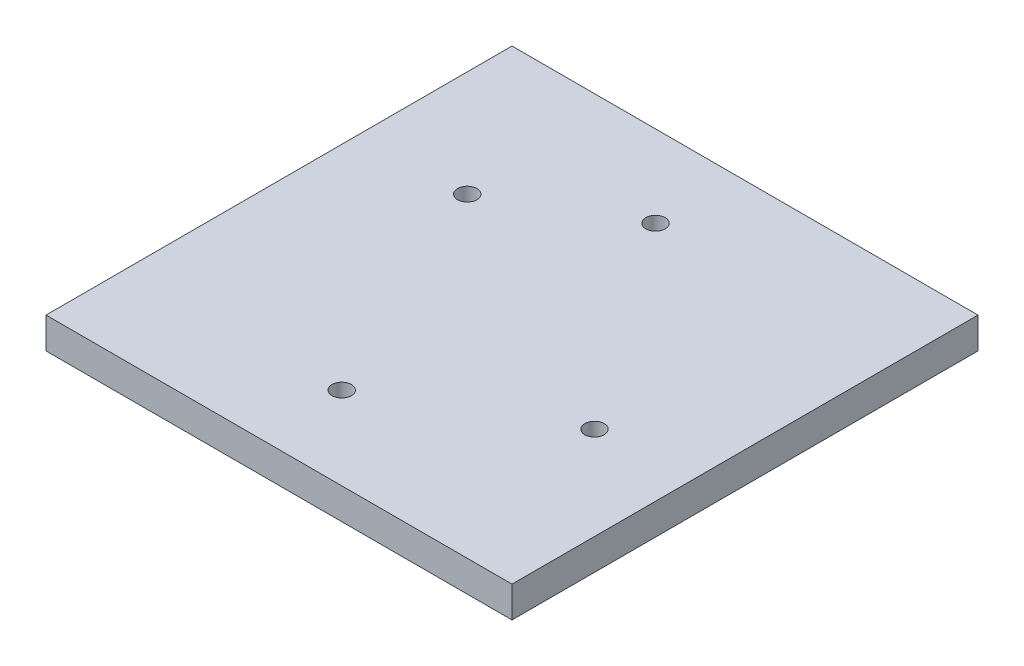
ISO-10303-21;
HEADER;
FILE_DESCRIPTION(('STEP AP214'),'2;1');
FILE_NAME('part.step','',(''),(''),'','','');
FILE_SCHEMA(('AUTOMOTIVE_DESIGN { 1 0 10303 214 1 1 1 1 }'));
ENDSEC;
DATA;
#1=APPLICATION_CONTEXT('core data for automotive mechanical design processes');
#2=APPLICATION_PROTOCOL_DEFINITION('international standard','automotive_design',2000,#1);
#3=PRODUCT_CONTEXT('',#1,'mechanical');
#4=PRODUCT('Part','Part','',(#3));
#5=PRODUCT_RELATED_PRODUCT_CATEGORY('part','',(#4));
#6=PRODUCT_DEFINITION_FORMATION('','',#4);
#7=PRODUCT_DEFINITION_CONTEXT('part definition',#1,'design');
#8=PRODUCT_DEFINITION('design','',#6,#7);
#9=PRODUCT_DEFINITION_SHAPE('','',#8);
#10=(LENGTH_UNIT() NAMED_UNIT(*) SI_UNIT(.MILLI.,.METRE.));
#11=(NAMED_UNIT(*) PLANE_ANGLE_UNIT() SI_UNIT($,.RADIAN.));
#12=(NAMED_UNIT(*) SI_UNIT($,.STERADIAN.) SOLID_ANGLE_UNIT());
#13=UNCERTAINTY_MEASURE_WITH_UNIT(LENGTH_MEASURE(1.E-05),#10,'distance_accuracy_value','');
#14=(GEOMETRIC_REPRESENTATION_CONTEXT(3) GLOBAL_UNCERTAINTY_ASSIGNED_CONTEXT((#13)) GLOBAL_UNIT_ASSIGNED_CONTEXT((#10,
#11,#12)) REPRESENTATION_CONTEXT('',''));
#15=CARTESIAN_POINT('',(0.,0.,0.));
#16=DIRECTION('',(0.,0.,1.));
#17=DIRECTION('',(1.,0.,0.));
#18=AXIS2_PLACEMENT_3D('',#15,#16,#17);
#19=CARTESIAN_POINT('',(76.2,10.16,76.2));
#20=DIRECTION('',(-1.,0.,0.));
#21=DIRECTION('',(0.,0.,1.));
#22=AXIS2_PLACEMENT_3D('',#19,#20,#21);
#23=PLANE('',#22);
#24=DIRECTION('',(0.,0.,-1.));
#25=VECTOR('',#24,1.);
#26=CARTESIAN_POINT('',(76.2,0.,76.2));
#27=LINE('',#26,#25);
#28=CARTESIAN_POINT('',(76.2,0.,76.2));
#29=VERTEX_POINT('',#28);
#30=CARTESIAN_POINT('',(76.2,0.,-76.2));
#31=VERTEX_POINT('',#30);
#32=EDGE_CURVE('E110',#29,#31,#27,.T.);
#33=ORIENTED_EDGE('',*,*,#32,.T.);
#34=DIRECTION('',(0.,-1.,0.));
#35=VECTOR('',#34,1.);
#36=CARTESIAN_POINT('',(76.2,10.16,-76.2));
#37=LINE('',#36,#35);
#38=CARTESIAN_POINT('',(76.2,10.16,-76.2));
#39=VERTEX_POINT('',#38);
#40=EDGE_CURVE('E42',#39,#31,#37,.T.);
#41=ORIENTED_EDGE('',*,*,#40,.F.);
#42=DIRECTION('',(0.,0.,-1.));
#43=VECTOR('',#42,1.);
#44=CARTESIAN_POINT('',(76.2,10.16,76.2));
#45=LINE('',#44,#43);
#46=CARTESIAN_POINT('',(76.2,10.16,76.2));
#47=VERTEX_POINT('',#46);
#48=EDGE_CURVE('E93',#47,#39,#45,.T.);
#49=ORIENTED_EDGE('',*,*,#48,.F.);
#50=DIRECTION('',(0.,-1.,0.));
#51=VECTOR('',#50,1.);
#52=CARTESIAN_POINT('',(76.2,10.16,76.2));
#53=LINE('',#52,#51);
#54=EDGE_CURVE('E106',#47,#29,#53,.T.);
#55=ORIENTED_EDGE('',*,*,#54,.T.);
#56=EDGE_LOOP('',(#33,#41,#49,#55));
#57=FACE_BOUND('',#56,.T.);
#58=ADVANCED_FACE('F39',(#57),#23,.F.);
#59=CARTESIAN_POINT('',(-76.2,10.16,-76.2));
#60=DIRECTION('',(0.,0.,1.));
#61=DIRECTION('',(1.,0.,0.));
#62=AXIS2_PLACEMENT_3D('',#59,#60,#61);
#63=PLANE('',#62);
#64=DIRECTION('',(-1.,0.,0.));
#65=VECTOR('',#64,1.);
#66=CARTESIAN_POINT('',(-76.2,0.,-76.2));
#67=LINE('',#66,#65);
#68=CARTESIAN_POINT('',(-76.2,0.,-76.2));
#69=VERTEX_POINT('',#68);
#70=EDGE_CURVE('E99',#31,#69,#67,.T.);
#71=ORIENTED_EDGE('',*,*,#70,.T.);
#72=DIRECTION('',(0.,-1.,0.));
#73=VECTOR('',#72,1.);
#74=CARTESIAN_POINT('',(-76.2,10.16,-76.2));
#75=LINE('',#74,#73);
#76=CARTESIAN_POINT('',(-76.2,10.16,-76.2));
#77=VERTEX_POINT('',#76);
#78=EDGE_CURVE('E97',#77,#69,#75,.T.);
#79=ORIENTED_EDGE('',*,*,#78,.F.);
#80=DIRECTION('',(-1.,0.,0.));
#81=VECTOR('',#80,1.);
#82=CARTESIAN_POINT('',(-76.2,10.16,-76.2));
#83=LINE('',#82,#81);
#84=EDGE_CURVE('E88',#39,#77,#83,.T.);
#85=ORIENTED_EDGE('',*,*,#84,.F.);
#86=ORIENTED_EDGE('',*,*,#40,.T.);
#87=EDGE_LOOP('',(#71,#79,#85,#86));
#88=FACE_BOUND('',#87,.T.);
#89=ADVANCED_FACE('F98',(#88),#63,.F.);
#90=CARTESIAN_POINT('',(-76.2,10.16,76.2));
#91=DIRECTION('',(1.,0.,0.));
#92=DIRECTION('',(0.,0.,-1.));
#93=AXIS2_PLACEMENT_3D('',#90,#91,#92);
#94=PLANE('',#93);
#95=DIRECTION('',(0.,0.,1.));
#96=VECTOR('',#95,1.);
#97=CARTESIAN_POINT('',(-76.2,0.,76.2));
#98=LINE('',#97,#96);
#99=CARTESIAN_POINT('',(-76.2,0.,76.2));
#100=VERTEX_POINT('',#99);
#101=EDGE_CURVE('E74',#69,#100,#98,.T.);
#102=ORIENTED_EDGE('',*,*,#101,.T.);
#103=DIRECTION('',(0.,-1.,0.));
#104=VECTOR('',#103,1.);
#105=CARTESIAN_POINT('',(-76.2,10.16,76.2));
#106=LINE('',#105,#104);
#107=CARTESIAN_POINT('',(-76.2,10.16,76.2));
#108=VERTEX_POINT('',#107);
#109=EDGE_CURVE('E101',#108,#100,#106,.T.);
#110=ORIENTED_EDGE('',*,*,#109,.F.);
#111=DIRECTION('',(0.,0.,1.));
#112=VECTOR('',#111,1.);
#113=CARTESIAN_POINT('',(-76.2,10.16,76.2));
#114=LINE('',#113,#112);
#115=EDGE_CURVE('E91',#77,#108,#114,.T.);
#116=ORIENTED_EDGE('',*,*,#115,.F.);
#117=ORIENTED_EDGE('',*,*,#78,.T.);
#118=EDGE_LOOP('',(#102,#110,#116,#117));
#119=FACE_BOUND('',#118,.T.);
#120=ADVANCED_FACE('F102',(#119),#94,.F.);
#121=CARTESIAN_POINT('',(-76.2,10.16,76.2));
#122=DIRECTION('',(0.,0.,-1.));
#123=DIRECTION('',(-1.,0.,0.));
#124=AXIS2_PLACEMENT_3D('',#121,#122,#123);
#125=PLANE('',#124);
#126=DIRECTION('',(1.,0.,0.));
#127=VECTOR('',#126,1.);
#128=CARTESIAN_POINT('',(-76.2,0.,76.2));
#129=LINE('',#128,#127);
#130=EDGE_CURVE('E80',#100,#29,#129,.T.);
#131=ORIENTED_EDGE('',*,*,#130,.T.);
#132=ORIENTED_EDGE('',*,*,#54,.F.);
#133=DIRECTION('',(1.,0.,0.));
#134=VECTOR('',#133,1.);
#135=CARTESIAN_POINT('',(-76.2,10.16,76.2));
#136=LINE('',#135,#134);
#137=EDGE_CURVE('E57',#108,#47,#136,.T.);
#138=ORIENTED_EDGE('',*,*,#137,.F.);
#139=ORIENTED_EDGE('',*,*,#109,.T.);
#140=EDGE_LOOP('',(#131,#132,#138,#139));
#141=FACE_BOUND('',#140,.T.);
#142=ADVANCED_FACE('F124',(#141),#125,.F.);
#143=CARTESIAN_POINT('',(0.,10.16,0.));
#144=DIRECTION('',(0.,-1.,0.));
#145=DIRECTION('',(0.,0.,-1.));
#146=AXIS2_PLACEMENT_3D('',#143,#144,#145);
#147=PLANE('',#146);
#148=CARTESIAN_POINT('',(-41.5722295500839,10.16,-26.925278647307));
#149=DIRECTION('',(0.,1.,0.));
#150=DIRECTION('',(0.,0.,1.));
#151=AXIS2_PLACEMENT_3D('',#148,#149,#150);
#152=CIRCLE('',#151,3.175);
#153=CARTESIAN_POINT('',(-41.5722295500839,10.16,-23.750278647307));
#154=VERTEX_POINT('',#153);
#155=EDGE_CURVE('E164',#154,#154,#152,.T.);
#156=ORIENTED_EDGE('',*,*,#155,.F.);
#157=EDGE_LOOP('',(#156));
#158=FACE_BOUND('',#157,.T.);
#159=CARTESIAN_POINT('',(-2.53186053750062,10.16,-49.4652462059843));
#160=DIRECTION('',(0.,1.,0.));
#161=DIRECTION('',(0.,0.,1.));
#162=AXIS2_PLACEMENT_3D('',#159,#160,#161);
#163=CIRCLE('',#162,3.175);
#164=CARTESIAN_POINT('',(-2.53186053750062,10.16,-46.2902462059843));
#165=VERTEX_POINT('',#164);
#166=EDGE_CURVE('E156',#165,#165,#163,.T.);
#167=ORIENTED_EDGE('',*,*,#166,.F.);
#168=EDGE_LOOP('',(#167));
#169=FACE_BOUND('',#168,.T.);
#170=CARTESIAN_POINT('',(-6.59476293844411,10.16,49.0890008228495));
#171=DIRECTION('',(0.,1.,0.));
#172=DIRECTION('',(0.,0.,1.));
#173=AXIS2_PLACEMENT_3D('',#170,#171,#172);
#174=CIRCLE('',#173,3.175);
#175=CARTESIAN_POINT('',(-6.59476293844411,10.16,52.2640008228495));
#176=VERTEX_POINT('',#175);
#177=EDGE_CURVE('E147',#176,#176,#174,.T.);
#178=ORIENTED_EDGE('',*,*,#177,.F.);
#179=EDGE_LOOP('',(#178));
#180=FACE_BOUND('',#179,.T.);
#181=CARTESIAN_POINT('',(45.809703228205,10.16,18.833268174796));
#182=DIRECTION('',(0.,1.,0.));
#183=DIRECTION('',(0.,0.,1.));
#184=AXIS2_PLACEMENT_3D('',#181,#182,#183);
#185=CIRCLE('',#184,3.175);
#186=CARTESIAN_POINT('',(45.809703228205,10.16,22.008268174796));
#187=VERTEX_POINT('',#186);
#188=EDGE_CURVE('E148',#187,#187,#185,.T.);
#189=ORIENTED_EDGE('',*,*,#188,.F.);
#190=EDGE_LOOP('',(#189));
#191=FACE_BOUND('',#190,.T.);
#192=ORIENTED_EDGE('',*,*,#48,.T.);
#193=ORIENTED_EDGE('',*,*,#84,.T.);
#194=ORIENTED_EDGE('',*,*,#115,.T.);
#195=ORIENTED_EDGE('',*,*,#137,.T.);
#196=EDGE_LOOP('',(#192,#193,#194,#195));
#197=FACE_BOUND('',#196,.T.);
#198=ADVANCED_FACE('F89',(#158,#169,#180,#191,#197),#147,.F.);
#199=CARTESIAN_POINT('',(0.,0.,0.));
#200=DIRECTION('',(0.,-1.,0.));
#201=DIRECTION('',(0.,0.,-1.));
#202=AXIS2_PLACEMENT_3D('',#199,#200,#201);
#203=PLANE('',#202);
#204=CARTESIAN_POINT('',(-41.5722295500839,0.,-26.925278647307));
#205=DIRECTION('',(0.,-1.,0.));
#206=DIRECTION('',(0.,0.,-1.));
#207=AXIS2_PLACEMENT_3D('',#204,#205,#206);
#208=CIRCLE('',#207,3.175);
#209=CARTESIAN_POINT('',(-41.5722295500839,0.,-30.100278647307));
#210=VERTEX_POINT('',#209);
#211=EDGE_CURVE('E139',#210,#210,#208,.F.);
#212=ORIENTED_EDGE('',*,*,#211,.T.);
#213=EDGE_LOOP('',(#212));
#214=FACE_BOUND('',#213,.T.);
#215=CARTESIAN_POINT('',(-2.53186053750062,0.,-49.4652462059843));
#216=DIRECTION('',(0.,-1.,0.));
#217=DIRECTION('',(0.,0.,-1.));
#218=AXIS2_PLACEMENT_3D('',#215,#216,#217);
#219=CIRCLE('',#218,3.175);
#220=CARTESIAN_POINT('',(-2.53186053750062,0.,-52.6402462059843));
#221=VERTEX_POINT('',#220);
#222=EDGE_CURVE('E160',#221,#221,#219,.F.);
#223=ORIENTED_EDGE('',*,*,#222,.T.);
#224=EDGE_LOOP('',(#223));
#225=FACE_BOUND('',#224,.T.);
#226=CARTESIAN_POINT('',(-6.59476293844411,0.,49.0890008228495));
#227=DIRECTION('',(0.,-1.,0.));
#228=DIRECTION('',(0.,0.,-1.));
#229=AXIS2_PLACEMENT_3D('',#226,#227,#228);
#230=CIRCLE('',#229,3.175);
#231=CARTESIAN_POINT('',(-6.59476293844411,0.,45.9140008228496));
#232=VERTEX_POINT('',#231);
#233=EDGE_CURVE('E152',#232,#232,#230,.F.);
#234=ORIENTED_EDGE('',*,*,#233,.T.);
#235=EDGE_LOOP('',(#234));
#236=FACE_BOUND('',#235,.T.);
#237=CARTESIAN_POINT('',(45.809703228205,0.,18.833268174796));
#238=DIRECTION('',(0.,-1.,0.));
#239=DIRECTION('',(0.,0.,-1.));
#240=AXIS2_PLACEMENT_3D('',#237,#238,#239);
#241=CIRCLE('',#240,3.175);
#242=CARTESIAN_POINT('',(45.809703228205,0.,15.658268174796));
#243=VERTEX_POINT('',#242);
#244=EDGE_CURVE('E143',#243,#243,#241,.F.);
#245=ORIENTED_EDGE('',*,*,#244,.T.);
#246=EDGE_LOOP('',(#245));
#247=FACE_BOUND('',#246,.T.);
#248=CARTESIAN_POINT('',(0.,0.,0.));
#249=DIRECTION('',(0.,-1.,0.));
#250=DIRECTION('',(0.,0.,-1.));
#251=AXIS2_PLACEMENT_3D('',#248,#249,#250);
#252=CIRCLE('',#251,38.1);
#253=CARTESIAN_POINT('',(0.,0.,-38.1));
#254=VERTEX_POINT('',#253);
#255=EDGE_CURVE('E11',#254,#254,#252,.T.);
#256=ORIENTED_EDGE('',*,*,#255,.F.);
#257=EDGE_LOOP('',(#256));
#258=FACE_BOUND('',#257,.T.);
#259=ORIENTED_EDGE('',*,*,#32,.F.);
#260=ORIENTED_EDGE('',*,*,#130,.F.);
#261=ORIENTED_EDGE('',*,*,#101,.F.);
#262=ORIENTED_EDGE('',*,*,#70,.F.);
#263=EDGE_LOOP('',(#259,#260,#261,#262));
#264=FACE_BOUND('',#263,.T.);
#265=ADVANCED_FACE('F127',(#214,#225,#236,#247,#258,#264),#203,.T.);
#266=CARTESIAN_POINT('',(0.,-12.7,0.));
#267=DIRECTION('',(0.,1.,0.));
#268=DIRECTION('',(0.,0.,1.));
#269=AXIS2_PLACEMENT_3D('',#266,#267,#268);
#270=CYLINDRICAL_SURFACE('',#269,38.1);
#271=CARTESIAN_POINT('',(0.,-12.7,0.));
#272=DIRECTION('',(0.,-1.,0.));
#273=DIRECTION('',(0.,0.,-1.));
#274=AXIS2_PLACEMENT_3D('',#271,#272,#273);
#275=CIRCLE('',#274,38.1);
#276=CARTESIAN_POINT('',(0.,-12.7,-38.1));
#277=VERTEX_POINT('',#276);
#278=EDGE_CURVE('E114',#277,#277,#275,.T.);
#279=ORIENTED_EDGE('',*,*,#278,.F.);
#280=EDGE_LOOP('',(#279));
#281=FACE_BOUND('',#280,.T.);
#282=ORIENTED_EDGE('',*,*,#255,.T.);
#283=EDGE_LOOP('',(#282));
#284=FACE_BOUND('',#283,.T.);
#285=ADVANCED_FACE('F197',(#281,#284),#270,.T.);
#286=CARTESIAN_POINT('',(0.,-12.7,0.));
#287=DIRECTION('',(0.,-1.,0.));
#288=DIRECTION('',(0.,0.,-1.));
#289=AXIS2_PLACEMENT_3D('',#286,#287,#288);
#290=PLANE('',#289);
#291=CARTESIAN_POINT('',(0.,-12.7,0.));
#292=DIRECTION('',(0.,-1.,0.));
#293=DIRECTION('',(0.,0.,-1.));
#294=AXIS2_PLACEMENT_3D('',#291,#292,#293);
#295=CIRCLE('',#294,4.);
#296=CARTESIAN_POINT('',(0.,-12.7,-4.));
#297=VERTEX_POINT('',#296);
#298=EDGE_CURVE('E135',#297,#297,#295,.T.);
#299=ORIENTED_EDGE('',*,*,#298,.F.);
#300=EDGE_LOOP('',(#299));
#301=FACE_BOUND('',#300,.T.);
#302=ORIENTED_EDGE('',*,*,#278,.T.);
#303=EDGE_LOOP('',(#302));
#304=FACE_BOUND('',#303,.T.);
#305=ADVANCED_FACE('F203',(#301,#304),#290,.T.);
#306=CARTESIAN_POINT('',(0.,-30.7,0.));
#307=DIRECTION('',(0.,1.,0.));
#308=DIRECTION('',(0.,0.,1.));
#309=AXIS2_PLACEMENT_3D('',#306,#307,#308);
#310=CYLINDRICAL_SURFACE('',#309,4.);
#311=CARTESIAN_POINT('',(0.,-30.7,0.));
#312=DIRECTION('',(0.,-1.,0.));
#313=DIRECTION('',(0.,0.,-1.));
#314=AXIS2_PLACEMENT_3D('',#311,#312,#313);
#315=CIRCLE('',#314,4.);
#316=CARTESIAN_POINT('',(0.,-30.7,-4.));
#317=VERTEX_POINT('',#316);
#318=EDGE_CURVE('E134',#317,#317,#315,.T.);
#319=ORIENTED_EDGE('',*,*,#318,.F.);
#320=EDGE_LOOP('',(#319));
#321=FACE_BOUND('',#320,.T.);
#322=ORIENTED_EDGE('',*,*,#298,.T.);
#323=EDGE_LOOP('',(#322));
#324=FACE_BOUND('',#323,.T.);
#325=ADVANCED_FACE('F209',(#321,#324),#310,.T.);
#326=CARTESIAN_POINT('',(0.,-30.7,0.));
#327=DIRECTION('',(0.,-1.,0.));
#328=DIRECTION('',(0.,0.,-1.));
#329=AXIS2_PLACEMENT_3D('',#326,#327,#328);
#330=PLANE('',#329);
#331=ORIENTED_EDGE('',*,*,#318,.T.);
#332=EDGE_LOOP('',(#331));
#333=FACE_BOUND('',#332,.T.);
#334=ADVANCED_FACE('F191',(#333),#330,.T.);
#335=CARTESIAN_POINT('',(45.809703228205,-8.98025612106915,18.833268174796));
#336=DIRECTION('',(0.,1.,0.));
#337=DIRECTION('',(0.,0.,1.));
#338=AXIS2_PLACEMENT_3D('',#335,#336,#337);
#339=CYLINDRICAL_SURFACE('',#338,3.175);
#340=ORIENTED_EDGE('',*,*,#188,.T.);
#341=EDGE_LOOP('',(#340));
#342=FACE_BOUND('',#341,.T.);
#343=ORIENTED_EDGE('',*,*,#244,.F.);
#344=EDGE_LOOP('',(#343));
#345=FACE_BOUND('',#344,.T.);
#346=ADVANCED_FACE('F187',(#342,#345),#339,.F.);
#347=CARTESIAN_POINT('',(-6.59476293844411,-8.98025612106915,49.0890008228495));
#348=DIRECTION('',(0.,1.,0.));
#349=DIRECTION('',(0.,0.,1.));
#350=AXIS2_PLACEMENT_3D('',#347,#348,#349);
#351=CYLINDRICAL_SURFACE('',#350,3.175);
#352=ORIENTED_EDGE('',*,*,#177,.T.);
#353=EDGE_LOOP('',(#352));
#354=FACE_BOUND('',#353,.T.);
#355=ORIENTED_EDGE('',*,*,#233,.F.);
#356=EDGE_LOOP('',(#355));
#357=FACE_BOUND('',#356,.T.);
#358=ADVANCED_FACE('F190',(#354,#357),#351,.F.);
#359=CARTESIAN_POINT('',(-2.53186053750062,-8.98025612106915,-49.4652462059843));
#360=DIRECTION('',(0.,1.,0.));
#361=DIRECTION('',(0.,0.,1.));
#362=AXIS2_PLACEMENT_3D('',#359,#360,#361);
#363=CYLINDRICAL_SURFACE('',#362,3.175);
#364=ORIENTED_EDGE('',*,*,#166,.T.);
#365=EDGE_LOOP('',(#364));
#366=FACE_BOUND('',#365,.T.);
#367=ORIENTED_EDGE('',*,*,#222,.F.);
#368=EDGE_LOOP('',(#367));
#369=FACE_BOUND('',#368,.T.);
#370=ADVANCED_FACE('F254',(#366,#369),#363,.F.);
#371=CARTESIAN_POINT('',(-41.5722295500839,-8.98025612106915,-26.925278647307));
#372=DIRECTION('',(0.,1.,0.));
#373=DIRECTION('',(0.,0.,1.));
#374=AXIS2_PLACEMENT_3D('',#371,#372,#373);
#375=CYLINDRICAL_SURFACE('',#374,3.175);
#376=ORIENTED_EDGE('',*,*,#155,.T.);
#377=EDGE_LOOP('',(#376));
#378=FACE_BOUND('',#377,.T.);
#379=ORIENTED_EDGE('',*,*,#211,.F.);
#380=EDGE_LOOP('',(#379));
#381=FACE_BOUND('',#380,.T.);
#382=ADVANCED_FACE('F175',(#378,#381),#375,.F.);
#383=CLOSED_SHELL('',(#58,#89,#120,#142,#198,#265,#285,#305,#325,#334,#346,#358,#370,#382));
#384=MANIFOLD_SOLID_BREP('B2',#383);
#385=ADVANCED_BREP_SHAPE_REPRESENTATION('',(#18,#384),#14);
#386=SHAPE_DEFINITION_REPRESENTATION(#9,#385);
ENDSEC;
END-ISO-10303-21;
